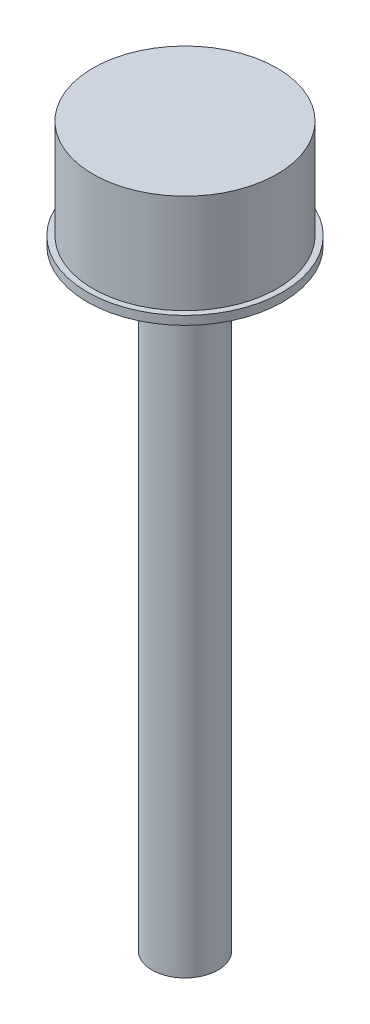
ISO-10303-21;
HEADER;
FILE_DESCRIPTION(('STEP AP214'),'2;1');
FILE_NAME('part.step','',(''),(''),'','','');
FILE_SCHEMA(('AUTOMOTIVE_DESIGN { 1 0 10303 214 1 1 1 1 }'));
ENDSEC;
DATA;
#1=APPLICATION_CONTEXT('core data for automotive mechanical design processes');
#2=APPLICATION_PROTOCOL_DEFINITION('international standard','automotive_design',2000,#1);
#3=PRODUCT_CONTEXT('',#1,'mechanical');
#4=PRODUCT('Part','Part','',(#3));
#5=PRODUCT_RELATED_PRODUCT_CATEGORY('part','',(#4));
#6=PRODUCT_DEFINITION_FORMATION('','',#4);
#7=PRODUCT_DEFINITION_CONTEXT('part definition',#1,'design');
#8=PRODUCT_DEFINITION('design','',#6,#7);
#9=PRODUCT_DEFINITION_SHAPE('','',#8);
#10=(LENGTH_UNIT() NAMED_UNIT(*) SI_UNIT(.MILLI.,.METRE.));
#11=(NAMED_UNIT(*) PLANE_ANGLE_UNIT() SI_UNIT($,.RADIAN.));
#12=(NAMED_UNIT(*) SI_UNIT($,.STERADIAN.) SOLID_ANGLE_UNIT());
#13=UNCERTAINTY_MEASURE_WITH_UNIT(LENGTH_MEASURE(1.E-05),#10,'distance_accuracy_value','');
#14=(GEOMETRIC_REPRESENTATION_CONTEXT(3) GLOBAL_UNCERTAINTY_ASSIGNED_CONTEXT((#13)) GLOBAL_UNIT_ASSIGNED_CONTEXT((#10,
#11,#12)) REPRESENTATION_CONTEXT('',''));
#15=CARTESIAN_POINT('',(0.,0.,0.));
#16=DIRECTION('',(0.,0.,1.));
#17=DIRECTION('',(1.,0.,0.));
#18=AXIS2_PLACEMENT_3D('',#15,#16,#17);
#19=CARTESIAN_POINT('',(-5.84199999999999,0.,0.));
#20=DIRECTION('',(0.,1.,0.));
#21=DIRECTION('',(0.,0.,1.));
#22=AXIS2_PLACEMENT_3D('',#19,#20,#21);
#23=PLANE('',#22);
#24=CARTESIAN_POINT('',(0.,0.,0.));
#25=DIRECTION('',(0.,-1.,0.));
#26=DIRECTION('',(0.,0.,-1.));
#27=AXIS2_PLACEMENT_3D('',#24,#25,#26);
#28=CIRCLE('',#27,5.84199999999999);
#29=CARTESIAN_POINT('',(0.,0.,-5.84199999999999));
#30=VERTEX_POINT('',#29);
#31=EDGE_CURVE('E64',#30,#30,#28,.T.);
#32=ORIENTED_EDGE('',*,*,#31,.T.);
#33=EDGE_LOOP('',(#32));
#34=FACE_BOUND('',#33,.T.);
#35=ADVANCED_FACE('F37',(#34),#23,.F.);
#36=CARTESIAN_POINT('',(0.,127.,0.));
#37=DIRECTION('',(0.,-1.,0.));
#38=DIRECTION('',(0.,0.,-1.));
#39=AXIS2_PLACEMENT_3D('',#36,#37,#38);
#40=PLANE('',#39);
#41=CARTESIAN_POINT('',(0.,127.,0.));
#42=DIRECTION('',(0.,-1.,0.));
#43=DIRECTION('',(0.,0.,-1.));
#44=AXIS2_PLACEMENT_3D('',#41,#42,#43);
#45=CIRCLE('',#44,16.256);
#46=CARTESIAN_POINT('',(0.,127.,-16.256));
#47=VERTEX_POINT('',#46);
#48=EDGE_CURVE('E10',#47,#47,#45,.T.);
#49=ORIENTED_EDGE('',*,*,#48,.F.);
#50=EDGE_LOOP('',(#49));
#51=FACE_BOUND('',#50,.T.);
#52=ADVANCED_FACE('F95',(#51),#40,.F.);
#53=CARTESIAN_POINT('',(0.,0.,0.));
#54=DIRECTION('',(0.,-1.,0.));
#55=DIRECTION('',(0.,0.,-1.));
#56=AXIS2_PLACEMENT_3D('',#53,#54,#55);
#57=CYLINDRICAL_SURFACE('',#56,16.256);
#58=CARTESIAN_POINT('',(0.,109.474,0.));
#59=DIRECTION('',(0.,-1.,0.));
#60=DIRECTION('',(0.,0.,-1.));
#61=AXIS2_PLACEMENT_3D('',#58,#59,#60);
#62=CIRCLE('',#61,16.256);
#63=CARTESIAN_POINT('',(0.,109.474,-16.256));
#64=VERTEX_POINT('',#63);
#65=EDGE_CURVE('E44',#64,#64,#62,.T.);
#66=ORIENTED_EDGE('',*,*,#65,.F.);
#67=EDGE_LOOP('',(#66));
#68=FACE_BOUND('',#67,.T.);
#69=ORIENTED_EDGE('',*,*,#48,.T.);
#70=EDGE_LOOP('',(#69));
#71=FACE_BOUND('',#70,.T.);
#72=ADVANCED_FACE('F90',(#68,#71),#57,.T.);
#73=CARTESIAN_POINT('',(-16.256,109.474,0.));
#74=DIRECTION('',(0.,-1.,0.));
#75=DIRECTION('',(0.,0.,-1.));
#76=AXIS2_PLACEMENT_3D('',#73,#74,#75);
#77=PLANE('',#76);
#78=CARTESIAN_POINT('',(0.,109.474,0.));
#79=DIRECTION('',(0.,-1.,0.));
#80=DIRECTION('',(0.,0.,-1.));
#81=AXIS2_PLACEMENT_3D('',#78,#79,#80);
#82=CIRCLE('',#81,17.272);
#83=CARTESIAN_POINT('',(0.,109.474,-17.272));
#84=VERTEX_POINT('',#83);
#85=EDGE_CURVE('E49',#84,#84,#82,.T.);
#86=ORIENTED_EDGE('',*,*,#85,.F.);
#87=EDGE_LOOP('',(#86));
#88=FACE_BOUND('',#87,.T.);
#89=ORIENTED_EDGE('',*,*,#65,.T.);
#90=EDGE_LOOP('',(#89));
#91=FACE_BOUND('',#90,.T.);
#92=ADVANCED_FACE('F85',(#88,#91),#77,.F.);
#93=CARTESIAN_POINT('',(0.,0.,0.));
#94=DIRECTION('',(0.,-1.,0.));
#95=DIRECTION('',(0.,0.,-1.));
#96=AXIS2_PLACEMENT_3D('',#93,#94,#95);
#97=CYLINDRICAL_SURFACE('',#96,17.272);
#98=CARTESIAN_POINT('',(0.,107.95,0.));
#99=DIRECTION('',(0.,-1.,0.));
#100=DIRECTION('',(0.,0.,-1.));
#101=AXIS2_PLACEMENT_3D('',#98,#99,#100);
#102=CIRCLE('',#101,17.272);
#103=CARTESIAN_POINT('',(0.,107.95,-17.272));
#104=VERTEX_POINT('',#103);
#105=EDGE_CURVE('E54',#104,#104,#102,.T.);
#106=ORIENTED_EDGE('',*,*,#105,.F.);
#107=EDGE_LOOP('',(#106));
#108=FACE_BOUND('',#107,.T.);
#109=ORIENTED_EDGE('',*,*,#85,.T.);
#110=EDGE_LOOP('',(#109));
#111=FACE_BOUND('',#110,.T.);
#112=ADVANCED_FACE('F79',(#108,#111),#97,.T.);
#113=CARTESIAN_POINT('',(-17.272,107.95,0.));
#114=DIRECTION('',(0.,1.,0.));
#115=DIRECTION('',(0.,0.,1.));
#116=AXIS2_PLACEMENT_3D('',#113,#114,#115);
#117=PLANE('',#116);
#118=CARTESIAN_POINT('',(0.,107.95,0.));
#119=DIRECTION('',(0.,-1.,0.));
#120=DIRECTION('',(0.,0.,-1.));
#121=AXIS2_PLACEMENT_3D('',#118,#119,#120);
#122=CIRCLE('',#121,5.842);
#123=CARTESIAN_POINT('',(0.,107.95,-5.842));
#124=VERTEX_POINT('',#123);
#125=EDGE_CURVE('E60',#124,#124,#122,.T.);
#126=ORIENTED_EDGE('',*,*,#125,.F.);
#127=EDGE_LOOP('',(#126));
#128=FACE_BOUND('',#127,.T.);
#129=ORIENTED_EDGE('',*,*,#105,.T.);
#130=EDGE_LOOP('',(#129));
#131=FACE_BOUND('',#130,.T.);
#132=ADVANCED_FACE('F73',(#128,#131),#117,.F.);
#133=CARTESIAN_POINT('',(0.,0.,0.));
#134=DIRECTION('',(0.,-1.,0.));
#135=DIRECTION('',(0.,0.,-1.));
#136=AXIS2_PLACEMENT_3D('',#133,#134,#135);
#137=CYLINDRICAL_SURFACE('',#136,5.84199999999999);
#138=ORIENTED_EDGE('',*,*,#31,.F.);
#139=EDGE_LOOP('',(#138));
#140=FACE_BOUND('',#139,.T.);
#141=ORIENTED_EDGE('',*,*,#125,.T.);
#142=EDGE_LOOP('',(#141));
#143=FACE_BOUND('',#142,.T.);
#144=ADVANCED_FACE('F70',(#140,#143),#137,.T.);
#145=CLOSED_SHELL('',(#35,#52,#72,#92,#112,#132,#144));
#146=MANIFOLD_SOLID_BREP('B2',#145);
#147=ADVANCED_BREP_SHAPE_REPRESENTATION('',(#18,#146),#14);
#148=SHAPE_DEFINITION_REPRESENTATION(#9,#147);
ENDSEC;
END-ISO-10303-21;
